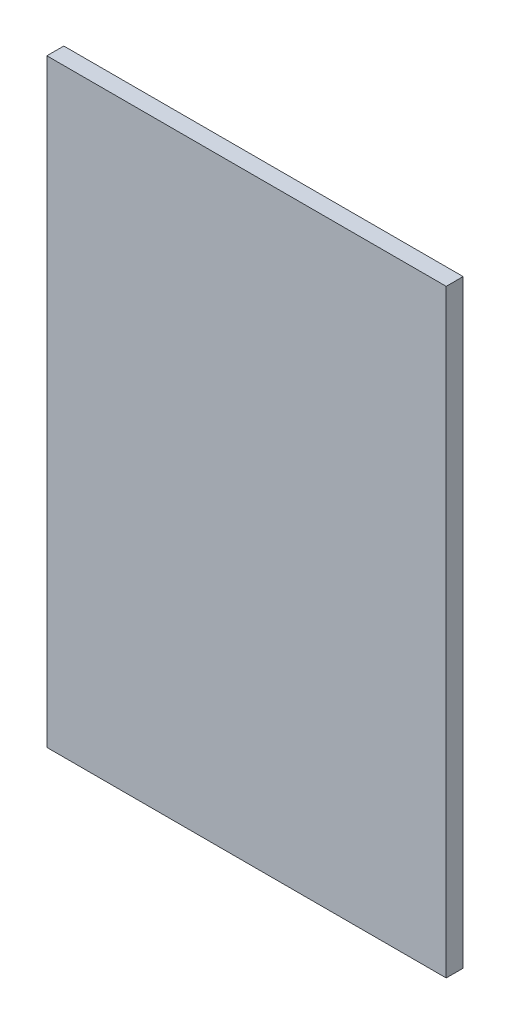
ISO-10303-21;
HEADER;
FILE_DESCRIPTION(('STEP AP214'),'2;1');
FILE_NAME('part.step','',(''),(''),'','','');
FILE_SCHEMA(('AUTOMOTIVE_DESIGN { 1 0 10303 214 1 1 1 1 }'));
ENDSEC;
DATA;
#1=APPLICATION_CONTEXT('core data for automotive mechanical design processes');
#2=APPLICATION_PROTOCOL_DEFINITION('international standard','automotive_design',2000,#1);
#3=PRODUCT_CONTEXT('',#1,'mechanical');
#4=PRODUCT('Part','Part','',(#3));
#5=PRODUCT_RELATED_PRODUCT_CATEGORY('part','',(#4));
#6=PRODUCT_DEFINITION_FORMATION('','',#4);
#7=PRODUCT_DEFINITION_CONTEXT('part definition',#1,'design');
#8=PRODUCT_DEFINITION('design','',#6,#7);
#9=PRODUCT_DEFINITION_SHAPE('','',#8);
#10=(LENGTH_UNIT() NAMED_UNIT(*) SI_UNIT(.MILLI.,.METRE.));
#11=(NAMED_UNIT(*) PLANE_ANGLE_UNIT() SI_UNIT($,.RADIAN.));
#12=(NAMED_UNIT(*) SI_UNIT($,.STERADIAN.) SOLID_ANGLE_UNIT());
#13=UNCERTAINTY_MEASURE_WITH_UNIT(LENGTH_MEASURE(1.E-05),#10,'distance_accuracy_value','');
#14=(GEOMETRIC_REPRESENTATION_CONTEXT(3) GLOBAL_UNCERTAINTY_ASSIGNED_CONTEXT((#13)) GLOBAL_UNIT_ASSIGNED_CONTEXT((#10,
#11,#12)) REPRESENTATION_CONTEXT('',''));
#15=CARTESIAN_POINT('',(0.,0.,0.));
#16=DIRECTION('',(0.,0.,1.));
#17=DIRECTION('',(1.,0.,0.));
#18=AXIS2_PLACEMENT_3D('',#15,#16,#17);
#19=CARTESIAN_POINT('',(-374.65,449.58,-12.7));
#20=DIRECTION('',(1.,0.,0.));
#21=DIRECTION('',(0.,0.,-1.));
#22=AXIS2_PLACEMENT_3D('',#19,#20,#21);
#23=PLANE('',#22);
#24=DIRECTION('',(0.,0.,1.));
#25=VECTOR('',#24,1.);
#26=CARTESIAN_POINT('',(-374.65,-449.58,-12.7));
#27=LINE('',#26,#25);
#28=CARTESIAN_POINT('',(-374.65,-449.58,-12.7));
#29=VERTEX_POINT('',#28);
#30=CARTESIAN_POINT('',(-374.65,-449.58,12.7));
#31=VERTEX_POINT('',#30);
#32=EDGE_CURVE('E113',#29,#31,#27,.T.);
#33=ORIENTED_EDGE('',*,*,#32,.T.);
#34=DIRECTION('',(0.,-1.,0.));
#35=VECTOR('',#34,1.);
#36=CARTESIAN_POINT('',(-374.65,449.58,12.7));
#37=LINE('',#36,#35);
#38=CARTESIAN_POINT('',(-374.65,449.58,12.7));
#39=VERTEX_POINT('',#38);
#40=EDGE_CURVE('E11',#39,#31,#37,.T.);
#41=ORIENTED_EDGE('',*,*,#40,.F.);
#42=DIRECTION('',(0.,0.,1.));
#43=VECTOR('',#42,1.);
#44=CARTESIAN_POINT('',(-374.65,449.58,-12.7));
#45=LINE('',#44,#43);
#46=CARTESIAN_POINT('',(-374.65,449.58,-12.7));
#47=VERTEX_POINT('',#46);
#48=EDGE_CURVE('E97',#47,#39,#45,.T.);
#49=ORIENTED_EDGE('',*,*,#48,.F.);
#50=DIRECTION('',(0.,-1.,0.));
#51=VECTOR('',#50,1.);
#52=CARTESIAN_POINT('',(-374.65,449.58,-12.7));
#53=LINE('',#52,#51);
#54=EDGE_CURVE('E109',#47,#29,#53,.T.);
#55=ORIENTED_EDGE('',*,*,#54,.T.);
#56=EDGE_LOOP('',(#33,#41,#49,#55));
#57=FACE_BOUND('',#56,.T.);
#58=ADVANCED_FACE('F45',(#57),#23,.F.);
#59=CARTESIAN_POINT('',(-374.65,449.58,12.7));
#60=DIRECTION('',(0.,0.,-1.));
#61=DIRECTION('',(-1.,0.,0.));
#62=AXIS2_PLACEMENT_3D('',#59,#60,#61);
#63=PLANE('',#62);
#64=DIRECTION('',(1.,0.,0.));
#65=VECTOR('',#64,1.);
#66=CARTESIAN_POINT('',(-374.65,-449.58,12.7));
#67=LINE('',#66,#65);
#68=CARTESIAN_POINT('',(224.79,-449.58,12.7));
#69=VERTEX_POINT('',#68);
#70=EDGE_CURVE('E102',#31,#69,#67,.T.);
#71=ORIENTED_EDGE('',*,*,#70,.T.);
#72=DIRECTION('',(0.,-1.,0.));
#73=VECTOR('',#72,1.);
#74=CARTESIAN_POINT('',(224.79,449.58,12.7));
#75=LINE('',#74,#73);
#76=CARTESIAN_POINT('',(224.79,449.58,12.7));
#77=VERTEX_POINT('',#76);
#78=EDGE_CURVE('E54',#77,#69,#75,.T.);
#79=ORIENTED_EDGE('',*,*,#78,.F.);
#80=DIRECTION('',(1.,0.,0.));
#81=VECTOR('',#80,1.);
#82=CARTESIAN_POINT('',(-374.65,449.58,12.7));
#83=LINE('',#82,#81);
#84=EDGE_CURVE('E92',#39,#77,#83,.T.);
#85=ORIENTED_EDGE('',*,*,#84,.F.);
#86=ORIENTED_EDGE('',*,*,#40,.T.);
#87=EDGE_LOOP('',(#71,#79,#85,#86));
#88=FACE_BOUND('',#87,.T.);
#89=ADVANCED_FACE('F101',(#88),#63,.F.);
#90=CARTESIAN_POINT('',(224.79,449.58,-12.7));
#91=DIRECTION('',(-1.,0.,0.));
#92=DIRECTION('',(0.,0.,1.));
#93=AXIS2_PLACEMENT_3D('',#90,#91,#92);
#94=PLANE('',#93);
#95=DIRECTION('',(0.,0.,-1.));
#96=VECTOR('',#95,1.);
#97=CARTESIAN_POINT('',(224.79,-449.58,-12.7));
#98=LINE('',#97,#96);
#99=CARTESIAN_POINT('',(224.79,-449.58,-12.7));
#100=VERTEX_POINT('',#99);
#101=EDGE_CURVE('E79',#69,#100,#98,.T.);
#102=ORIENTED_EDGE('',*,*,#101,.T.);
#103=DIRECTION('',(0.,-1.,0.));
#104=VECTOR('',#103,1.);
#105=CARTESIAN_POINT('',(224.79,449.58,-12.7));
#106=LINE('',#105,#104);
#107=CARTESIAN_POINT('',(224.79,449.58,-12.7));
#108=VERTEX_POINT('',#107);
#109=EDGE_CURVE('E104',#108,#100,#106,.T.);
#110=ORIENTED_EDGE('',*,*,#109,.F.);
#111=DIRECTION('',(0.,0.,-1.));
#112=VECTOR('',#111,1.);
#113=CARTESIAN_POINT('',(224.79,449.58,-12.7));
#114=LINE('',#113,#112);
#115=EDGE_CURVE('E95',#77,#108,#114,.T.);
#116=ORIENTED_EDGE('',*,*,#115,.F.);
#117=ORIENTED_EDGE('',*,*,#78,.T.);
#118=EDGE_LOOP('',(#102,#110,#116,#117));
#119=FACE_BOUND('',#118,.T.);
#120=ADVANCED_FACE('F105',(#119),#94,.F.);
#121=CARTESIAN_POINT('',(-374.65,449.58,-12.7));
#122=DIRECTION('',(0.,0.,1.));
#123=DIRECTION('',(1.,0.,0.));
#124=AXIS2_PLACEMENT_3D('',#121,#122,#123);
#125=PLANE('',#124);
#126=DIRECTION('',(-1.,0.,0.));
#127=VECTOR('',#126,1.);
#128=CARTESIAN_POINT('',(-374.65,-449.58,-12.7));
#129=LINE('',#128,#127);
#130=EDGE_CURVE('E85',#100,#29,#129,.T.);
#131=ORIENTED_EDGE('',*,*,#130,.T.);
#132=ORIENTED_EDGE('',*,*,#54,.F.);
#133=DIRECTION('',(-1.,0.,0.));
#134=VECTOR('',#133,1.);
#135=CARTESIAN_POINT('',(-374.65,449.58,-12.7));
#136=LINE('',#135,#134);
#137=EDGE_CURVE('E62',#108,#47,#136,.T.);
#138=ORIENTED_EDGE('',*,*,#137,.F.);
#139=ORIENTED_EDGE('',*,*,#109,.T.);
#140=EDGE_LOOP('',(#131,#132,#138,#139));
#141=FACE_BOUND('',#140,.T.);
#142=ADVANCED_FACE('F126',(#141),#125,.F.);
#143=CARTESIAN_POINT('',(0.,449.58,0.));
#144=DIRECTION('',(0.,1.,0.));
#145=DIRECTION('',(0.,0.,1.));
#146=AXIS2_PLACEMENT_3D('',#143,#144,#145);
#147=PLANE('',#146);
#148=ORIENTED_EDGE('',*,*,#48,.T.);
#149=ORIENTED_EDGE('',*,*,#84,.T.);
#150=ORIENTED_EDGE('',*,*,#115,.T.);
#151=ORIENTED_EDGE('',*,*,#137,.T.);
#152=EDGE_LOOP('',(#148,#149,#150,#151));
#153=FACE_BOUND('',#152,.T.);
#154=ADVANCED_FACE('F93',(#153),#147,.T.);
#155=CARTESIAN_POINT('',(0.,-449.58,0.));
#156=DIRECTION('',(0.,1.,0.));
#157=DIRECTION('',(0.,0.,1.));
#158=AXIS2_PLACEMENT_3D('',#155,#156,#157);
#159=PLANE('',#158);
#160=ORIENTED_EDGE('',*,*,#32,.F.);
#161=ORIENTED_EDGE('',*,*,#130,.F.);
#162=ORIENTED_EDGE('',*,*,#101,.F.);
#163=ORIENTED_EDGE('',*,*,#70,.F.);
#164=EDGE_LOOP('',(#160,#161,#162,#163));
#165=FACE_BOUND('',#164,.T.);
#166=ADVANCED_FACE('F129',(#165),#159,.F.);
#167=CLOSED_SHELL('',(#58,#89,#120,#142,#154,#166));
#168=MANIFOLD_SOLID_BREP('B2',#167);
#169=ADVANCED_BREP_SHAPE_REPRESENTATION('',(#18,#168),#14);
#170=SHAPE_DEFINITION_REPRESENTATION(#9,#169);
ENDSEC;
END-ISO-10303-21;
